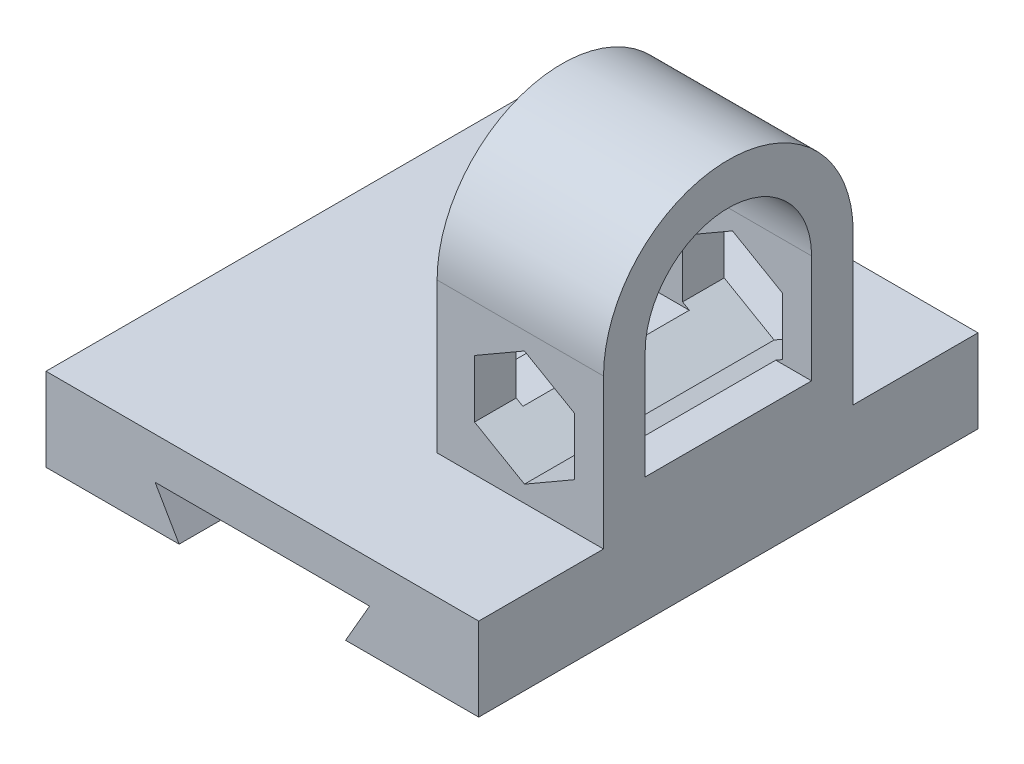
ISO-10303-21;
HEADER;
FILE_DESCRIPTION(('STEP AP214'),'2;1');
FILE_NAME('part.step','',(''),(''),'','','');
FILE_SCHEMA(('AUTOMOTIVE_DESIGN { 1 0 10303 214 1 1 1 1 }'));
ENDSEC;
DATA;
#1=APPLICATION_CONTEXT('core data for automotive mechanical design processes');
#2=APPLICATION_PROTOCOL_DEFINITION('international standard','automotive_design',2000,#1);
#3=PRODUCT_CONTEXT('',#1,'mechanical');
#4=PRODUCT('Part','Part','',(#3));
#5=PRODUCT_RELATED_PRODUCT_CATEGORY('part','',(#4));
#6=PRODUCT_DEFINITION_FORMATION('','',#4);
#7=PRODUCT_DEFINITION_CONTEXT('part definition',#1,'design');
#8=PRODUCT_DEFINITION('design','',#6,#7);
#9=PRODUCT_DEFINITION_SHAPE('','',#8);
#10=(LENGTH_UNIT() NAMED_UNIT(*) SI_UNIT(.MILLI.,.METRE.));
#11=(NAMED_UNIT(*) PLANE_ANGLE_UNIT() SI_UNIT($,.RADIAN.));
#12=(NAMED_UNIT(*) SI_UNIT($,.STERADIAN.) SOLID_ANGLE_UNIT());
#13=UNCERTAINTY_MEASURE_WITH_UNIT(LENGTH_MEASURE(1.E-05),#10,'distance_accuracy_value','');
#14=(GEOMETRIC_REPRESENTATION_CONTEXT(3) GLOBAL_UNCERTAINTY_ASSIGNED_CONTEXT((#13)) GLOBAL_UNIT_ASSIGNED_CONTEXT((#10,
#11,#12)) REPRESENTATION_CONTEXT('',''));
#15=CARTESIAN_POINT('',(0.,0.,0.));
#16=DIRECTION('',(0.,0.,1.));
#17=DIRECTION('',(1.,0.,0.));
#18=AXIS2_PLACEMENT_3D('',#15,#16,#17);
#19=CARTESIAN_POINT('',(5.99999999999999,9.99999999999998,0.));
#20=DIRECTION('',(0.,1.,0.));
#21=DIRECTION('',(-1.,0.,0.));
#22=AXIS2_PLACEMENT_3D('',#19,#20,#21);
#23=PLANE('',#22);
#24=DIRECTION('',(0.,0.,1.));
#25=VECTOR('',#24,1.);
#26=CARTESIAN_POINT('',(21.6961524227066,10.,-30.001));
#27=LINE('',#26,#25);
#28=CARTESIAN_POINT('',(21.6961524227066,10.,-10.));
#29=VERTEX_POINT('',#28);
#30=CARTESIAN_POINT('',(21.6961524227066,9.99999999999999,9.99999999999999));
#31=VERTEX_POINT('',#30);
#32=EDGE_CURVE('E638',#29,#31,#27,.T.);
#33=ORIENTED_EDGE('',*,*,#32,.T.);
#34=DIRECTION('',(1.,0.,0.));
#35=VECTOR('',#34,1.);
#36=CARTESIAN_POINT('',(5.99999999999999,9.99999999999998,10.));
#37=LINE('',#36,#35);
#38=CARTESIAN_POINT('',(26.,10.,10.));
#39=VERTEX_POINT('',#38);
#40=EDGE_CURVE('E282',#31,#39,#37,.T.);
#41=ORIENTED_EDGE('',*,*,#40,.T.);
#42=DIRECTION('',(0.,0.,1.));
#43=VECTOR('',#42,1.);
#44=CARTESIAN_POINT('',(26.,10.,0.));
#45=LINE('',#44,#43);
#46=CARTESIAN_POINT('',(26.,10.,-10.));
#47=VERTEX_POINT('',#46);
#48=EDGE_CURVE('E682',#47,#39,#45,.T.);
#49=ORIENTED_EDGE('',*,*,#48,.F.);
#50=DIRECTION('',(1.,0.,0.));
#51=VECTOR('',#50,1.);
#52=CARTESIAN_POINT('',(5.99999999999999,9.99999999999998,-10.));
#53=LINE('',#52,#51);
#54=EDGE_CURVE('E281',#29,#47,#53,.T.);
#55=ORIENTED_EDGE('',*,*,#54,.F.);
#56=EDGE_LOOP('',(#33,#41,#49,#55));
#57=FACE_BOUND('',#56,.T.);
#58=ADVANCED_FACE('F59',(#57),#23,.T.);
#59=CARTESIAN_POINT('',(-26.,5.,30.));
#60=DIRECTION('',(0.,-1.,0.));
#61=DIRECTION('',(1.,0.,0.));
#62=AXIS2_PLACEMENT_3D('',#59,#60,#61);
#63=PLANE('',#62);
#64=DIRECTION('',(1.,0.,0.));
#65=VECTOR('',#64,1.);
#66=CARTESIAN_POINT('',(6.,4.99999999999998,15.));
#67=LINE('',#66,#65);
#68=CARTESIAN_POINT('',(6.,4.99999999999998,15.));
#69=VERTEX_POINT('',#68);
#70=CARTESIAN_POINT('',(26.,5.,15.));
#71=VERTEX_POINT('',#70);
#72=EDGE_CURVE('E312',#69,#71,#67,.T.);
#73=ORIENTED_EDGE('',*,*,#72,.F.);
#74=DIRECTION('',(0.,0.,1.));
#75=VECTOR('',#74,1.);
#76=CARTESIAN_POINT('',(6.,4.99999999999998,0.));
#77=LINE('',#76,#75);
#78=CARTESIAN_POINT('',(6.,4.99999999999998,-15.));
#79=VERTEX_POINT('',#78);
#80=EDGE_CURVE('E300',#79,#69,#77,.T.);
#81=ORIENTED_EDGE('',*,*,#80,.F.);
#82=DIRECTION('',(1.,0.,0.));
#83=VECTOR('',#82,1.);
#84=CARTESIAN_POINT('',(6.,4.99999999999998,-15.));
#85=LINE('',#84,#83);
#86=CARTESIAN_POINT('',(26.,5.,-15.));
#87=VERTEX_POINT('',#86);
#88=EDGE_CURVE('E314',#79,#87,#85,.T.);
#89=ORIENTED_EDGE('',*,*,#88,.T.);
#90=DIRECTION('',(0.,0.,-1.));
#91=VECTOR('',#90,1.);
#92=CARTESIAN_POINT('',(26.,5.,30.));
#93=LINE('',#92,#91);
#94=CARTESIAN_POINT('',(26.,5.,-30.));
#95=VERTEX_POINT('',#94);
#96=EDGE_CURVE('E358',#87,#95,#93,.T.);
#97=ORIENTED_EDGE('',*,*,#96,.T.);
#98=DIRECTION('',(-1.,0.,0.));
#99=VECTOR('',#98,1.);
#100=CARTESIAN_POINT('',(-26.,5.,-30.));
#101=LINE('',#100,#99);
#102=CARTESIAN_POINT('',(-26.,5.,-30.));
#103=VERTEX_POINT('',#102);
#104=EDGE_CURVE('E325',#95,#103,#101,.T.);
#105=ORIENTED_EDGE('',*,*,#104,.T.);
#106=DIRECTION('',(0.,0.,-1.));
#107=VECTOR('',#106,1.);
#108=CARTESIAN_POINT('',(-26.,5.,30.));
#109=LINE('',#108,#107);
#110=CARTESIAN_POINT('',(-26.,5.,30.));
#111=VERTEX_POINT('',#110);
#112=EDGE_CURVE('E339',#111,#103,#109,.T.);
#113=ORIENTED_EDGE('',*,*,#112,.F.);
#114=DIRECTION('',(-1.,0.,0.));
#115=VECTOR('',#114,1.);
#116=CARTESIAN_POINT('',(-26.,5.,30.));
#117=LINE('',#116,#115);
#118=CARTESIAN_POINT('',(26.,5.,30.));
#119=VERTEX_POINT('',#118);
#120=EDGE_CURVE('E337',#119,#111,#117,.T.);
#121=ORIENTED_EDGE('',*,*,#120,.F.);
#122=EDGE_CURVE('E359',#119,#71,#93,.T.);
#123=ORIENTED_EDGE('',*,*,#122,.T.);
#124=EDGE_LOOP('',(#73,#81,#89,#97,#105,#113,#121,#123));
#125=FACE_BOUND('',#124,.T.);
#126=ADVANCED_FACE('F408',(#125),#63,.F.);
#127=CARTESIAN_POINT('',(-26.,-5.00000000000001,30.));
#128=DIRECTION('',(1.,0.,0.));
#129=DIRECTION('',(0.,0.,-1.));
#130=AXIS2_PLACEMENT_3D('',#127,#128,#129);
#131=PLANE('',#130);
#132=DIRECTION('',(0.,-1.,0.));
#133=VECTOR('',#132,1.);
#134=CARTESIAN_POINT('',(-26.,-5.00000000000001,-30.));
#135=LINE('',#134,#133);
#136=CARTESIAN_POINT('',(-26.,-5.00000000000001,-30.));
#137=VERTEX_POINT('',#136);
#138=EDGE_CURVE('E320',#103,#137,#135,.T.);
#139=ORIENTED_EDGE('',*,*,#138,.T.);
#140=DIRECTION('',(0.,0.,-1.));
#141=VECTOR('',#140,1.);
#142=CARTESIAN_POINT('',(-26.,-5.00000000000001,30.));
#143=LINE('',#142,#141);
#144=CARTESIAN_POINT('',(-26.,-5.00000000000001,30.));
#145=VERTEX_POINT('',#144);
#146=EDGE_CURVE('E12',#145,#137,#143,.T.);
#147=ORIENTED_EDGE('',*,*,#146,.F.);
#148=DIRECTION('',(0.,-1.,0.));
#149=VECTOR('',#148,1.);
#150=CARTESIAN_POINT('',(-26.,-5.00000000000001,30.));
#151=LINE('',#150,#149);
#152=EDGE_CURVE('E321',#111,#145,#151,.T.);
#153=ORIENTED_EDGE('',*,*,#152,.F.);
#154=ORIENTED_EDGE('',*,*,#112,.T.);
#155=EDGE_LOOP('',(#139,#147,#153,#154));
#156=FACE_BOUND('',#155,.T.);
#157=ADVANCED_FACE('F61',(#156),#131,.F.);
#158=CARTESIAN_POINT('',(-9.99999999999999,-5.,30.));
#159=DIRECTION('',(0.,1.,0.));
#160=DIRECTION('',(-1.,0.,0.));
#161=AXIS2_PLACEMENT_3D('',#158,#159,#160);
#162=PLANE('',#161);
#163=DIRECTION('',(1.,0.,0.));
#164=VECTOR('',#163,1.);
#165=CARTESIAN_POINT('',(-9.99999999999999,-5.,-30.));
#166=LINE('',#165,#164);
#167=CARTESIAN_POINT('',(-9.99999999999999,-5.,-30.));
#168=VERTEX_POINT('',#167);
#169=EDGE_CURVE('E342',#137,#168,#166,.T.);
#170=ORIENTED_EDGE('',*,*,#169,.T.);
#171=DIRECTION('',(0.,0.,-1.));
#172=VECTOR('',#171,1.);
#173=CARTESIAN_POINT('',(-9.99999999999999,-5.,30.));
#174=LINE('',#173,#172);
#175=CARTESIAN_POINT('',(-9.99999999999999,-5.,30.));
#176=VERTEX_POINT('',#175);
#177=EDGE_CURVE('E67',#176,#168,#174,.T.);
#178=ORIENTED_EDGE('',*,*,#177,.F.);
#179=DIRECTION('',(1.,0.,0.));
#180=VECTOR('',#179,1.);
#181=CARTESIAN_POINT('',(-9.99999999999999,-5.,30.));
#182=LINE('',#181,#180);
#183=EDGE_CURVE('E324',#145,#176,#182,.T.);
#184=ORIENTED_EDGE('',*,*,#183,.F.);
#185=ORIENTED_EDGE('',*,*,#146,.T.);
#186=EDGE_LOOP('',(#170,#178,#184,#185));
#187=FACE_BOUND('',#186,.T.);
#188=ADVANCED_FACE('F401',(#187),#162,.F.);
#189=CARTESIAN_POINT('',(-12.8867513459481,0.,30.));
#190=DIRECTION('',(-0.866025403784438,-0.500000000000001,0.));
#191=DIRECTION('',(0.500000000000001,-0.866025403784438,0.));
#192=AXIS2_PLACEMENT_3D('',#189,#190,#191);
#193=PLANE('',#192);
#194=DIRECTION('',(-0.500000000000001,0.866025403784438,0.));
#195=VECTOR('',#194,1.);
#196=CARTESIAN_POINT('',(-12.8867513459481,0.,-30.));
#197=LINE('',#196,#195);
#198=CARTESIAN_POINT('',(-12.8867513459481,0.,-30.));
#199=VERTEX_POINT('',#198);
#200=EDGE_CURVE('E344',#168,#199,#197,.T.);
#201=ORIENTED_EDGE('',*,*,#200,.T.);
#202=DIRECTION('',(0.,0.,-1.));
#203=VECTOR('',#202,1.);
#204=CARTESIAN_POINT('',(-12.8867513459481,0.,30.));
#205=LINE('',#204,#203);
#206=CARTESIAN_POINT('',(-12.8867513459481,0.,30.));
#207=VERTEX_POINT('',#206);
#208=EDGE_CURVE('E371',#207,#199,#205,.T.);
#209=ORIENTED_EDGE('',*,*,#208,.F.);
#210=DIRECTION('',(-0.500000000000001,0.866025403784438,0.));
#211=VECTOR('',#210,1.);
#212=CARTESIAN_POINT('',(-12.8867513459481,0.,30.));
#213=LINE('',#212,#211);
#214=EDGE_CURVE('E327',#176,#207,#213,.T.);
#215=ORIENTED_EDGE('',*,*,#214,.F.);
#216=ORIENTED_EDGE('',*,*,#177,.T.);
#217=EDGE_LOOP('',(#201,#209,#215,#216));
#218=FACE_BOUND('',#217,.T.);
#219=ADVANCED_FACE('F378',(#218),#193,.F.);
#220=CARTESIAN_POINT('',(12.8867513459482,0.,30.));
#221=DIRECTION('',(0.,1.,0.));
#222=DIRECTION('',(-1.,0.,0.));
#223=AXIS2_PLACEMENT_3D('',#220,#221,#222);
#224=PLANE('',#223);
#225=DIRECTION('',(1.,0.,0.));
#226=VECTOR('',#225,1.);
#227=CARTESIAN_POINT('',(12.8867513459482,0.,-30.));
#228=LINE('',#227,#226);
#229=CARTESIAN_POINT('',(12.8867513459482,0.,-30.));
#230=VERTEX_POINT('',#229);
#231=EDGE_CURVE('E346',#199,#230,#228,.T.);
#232=ORIENTED_EDGE('',*,*,#231,.T.);
#233=DIRECTION('',(0.,0.,-1.));
#234=VECTOR('',#233,1.);
#235=CARTESIAN_POINT('',(12.8867513459482,0.,30.));
#236=LINE('',#235,#234);
#237=CARTESIAN_POINT('',(12.8867513459482,0.,30.));
#238=VERTEX_POINT('',#237);
#239=EDGE_CURVE('E368',#238,#230,#236,.T.);
#240=ORIENTED_EDGE('',*,*,#239,.F.);
#241=DIRECTION('',(1.,0.,0.));
#242=VECTOR('',#241,1.);
#243=CARTESIAN_POINT('',(12.8867513459482,0.,30.));
#244=LINE('',#243,#242);
#245=EDGE_CURVE('E329',#207,#238,#244,.T.);
#246=ORIENTED_EDGE('',*,*,#245,.F.);
#247=ORIENTED_EDGE('',*,*,#208,.T.);
#248=EDGE_LOOP('',(#232,#240,#246,#247));
#249=FACE_BOUND('',#248,.T.);
#250=ADVANCED_FACE('F389',(#249),#224,.F.);
#251=CARTESIAN_POINT('',(10.,-5.,30.));
#252=DIRECTION('',(0.866025403784436,-0.500000000000005,0.));
#253=DIRECTION('',(0.500000000000005,0.866025403784436,0.));
#254=AXIS2_PLACEMENT_3D('',#251,#252,#253);
#255=PLANE('',#254);
#256=DIRECTION('',(-0.500000000000005,-0.866025403784436,0.));
#257=VECTOR('',#256,1.);
#258=CARTESIAN_POINT('',(10.,-5.,-30.));
#259=LINE('',#258,#257);
#260=CARTESIAN_POINT('',(10.,-5.,-30.));
#261=VERTEX_POINT('',#260);
#262=EDGE_CURVE('E348',#230,#261,#259,.T.);
#263=ORIENTED_EDGE('',*,*,#262,.T.);
#264=DIRECTION('',(0.,0.,-1.));
#265=VECTOR('',#264,1.);
#266=CARTESIAN_POINT('',(10.,-5.,30.));
#267=LINE('',#266,#265);
#268=CARTESIAN_POINT('',(10.,-5.,30.));
#269=VERTEX_POINT('',#268);
#270=EDGE_CURVE('E365',#269,#261,#267,.T.);
#271=ORIENTED_EDGE('',*,*,#270,.F.);
#272=DIRECTION('',(-0.500000000000005,-0.866025403784436,0.));
#273=VECTOR('',#272,1.);
#274=CARTESIAN_POINT('',(10.,-5.,30.));
#275=LINE('',#274,#273);
#276=EDGE_CURVE('E331',#238,#269,#275,.T.);
#277=ORIENTED_EDGE('',*,*,#276,.F.);
#278=ORIENTED_EDGE('',*,*,#239,.T.);
#279=EDGE_LOOP('',(#263,#271,#277,#278));
#280=FACE_BOUND('',#279,.T.);
#281=ADVANCED_FACE('F393',(#280),#255,.F.);
#282=CARTESIAN_POINT('',(26.,-5.,30.));
#283=DIRECTION('',(0.,1.,0.));
#284=DIRECTION('',(-1.,0.,0.));
#285=AXIS2_PLACEMENT_3D('',#282,#283,#284);
#286=PLANE('',#285);
#287=DIRECTION('',(1.,0.,0.));
#288=VECTOR('',#287,1.);
#289=CARTESIAN_POINT('',(26.,-5.,-30.));
#290=LINE('',#289,#288);
#291=CARTESIAN_POINT('',(26.,-5.,-30.));
#292=VERTEX_POINT('',#291);
#293=EDGE_CURVE('E350',#261,#292,#290,.T.);
#294=ORIENTED_EDGE('',*,*,#293,.T.);
#295=DIRECTION('',(0.,0.,-1.));
#296=VECTOR('',#295,1.);
#297=CARTESIAN_POINT('',(26.,-5.,30.));
#298=LINE('',#297,#296);
#299=CARTESIAN_POINT('',(26.,-5.,30.));
#300=VERTEX_POINT('',#299);
#301=EDGE_CURVE('E362',#300,#292,#298,.T.);
#302=ORIENTED_EDGE('',*,*,#301,.F.);
#303=DIRECTION('',(1.,0.,0.));
#304=VECTOR('',#303,1.);
#305=CARTESIAN_POINT('',(26.,-5.,30.));
#306=LINE('',#305,#304);
#307=EDGE_CURVE('E333',#269,#300,#306,.T.);
#308=ORIENTED_EDGE('',*,*,#307,.F.);
#309=ORIENTED_EDGE('',*,*,#270,.T.);
#310=EDGE_LOOP('',(#294,#302,#308,#309));
#311=FACE_BOUND('',#310,.T.);
#312=ADVANCED_FACE('F419',(#311),#286,.F.);
#313=CARTESIAN_POINT('',(26.,5.,30.));
#314=DIRECTION('',(-1.,0.,0.));
#315=DIRECTION('',(0.,-1.,0.));
#316=AXIS2_PLACEMENT_3D('',#313,#314,#315);
#317=PLANE('',#316);
#318=DIRECTION('',(0.,1.,0.));
#319=VECTOR('',#318,1.);
#320=CARTESIAN_POINT('',(26.,5.,-30.));
#321=LINE('',#320,#319);
#322=EDGE_CURVE('E352',#292,#95,#321,.T.);
#323=ORIENTED_EDGE('',*,*,#322,.T.);
#324=ORIENTED_EDGE('',*,*,#96,.F.);
#325=DIRECTION('',(0.,-1.,0.));
#326=VECTOR('',#325,1.);
#327=CARTESIAN_POINT('',(26.,0.,-15.));
#328=LINE('',#327,#326);
#329=CARTESIAN_POINT('',(26.,23.,-15.));
#330=VERTEX_POINT('',#329);
#331=EDGE_CURVE('E307',#330,#87,#328,.T.);
#332=ORIENTED_EDGE('',*,*,#331,.F.);
#333=CARTESIAN_POINT('',(26.,23.,0.));
#334=DIRECTION('',(1.,0.,0.));
#335=DIRECTION('',(0.,1.,0.));
#336=AXIS2_PLACEMENT_3D('',#333,#334,#335);
#337=CIRCLE('',#336,15.);
#338=CARTESIAN_POINT('',(26.,23.,15.));
#339=VERTEX_POINT('',#338);
#340=EDGE_CURVE('E293',#339,#330,#337,.F.);
#341=ORIENTED_EDGE('',*,*,#340,.F.);
#342=DIRECTION('',(0.,1.,0.));
#343=VECTOR('',#342,1.);
#344=CARTESIAN_POINT('',(26.,0.,15.));
#345=LINE('',#344,#343);
#346=EDGE_CURVE('E298',#71,#339,#345,.T.);
#347=ORIENTED_EDGE('',*,*,#346,.F.);
#348=ORIENTED_EDGE('',*,*,#122,.F.);
#349=DIRECTION('',(0.,1.,0.));
#350=VECTOR('',#349,1.);
#351=CARTESIAN_POINT('',(26.,5.,30.));
#352=LINE('',#351,#350);
#353=EDGE_CURVE('E335',#300,#119,#352,.T.);
#354=ORIENTED_EDGE('',*,*,#353,.F.);
#355=ORIENTED_EDGE('',*,*,#301,.T.);
#356=EDGE_LOOP('',(#323,#324,#332,#341,#347,#348,#354,#355));
#357=FACE_BOUND('',#356,.T.);
#358=DIRECTION('',(0.,1.,0.));
#359=VECTOR('',#358,1.);
#360=CARTESIAN_POINT('',(26.,0.,10.));
#361=LINE('',#360,#359);
#362=CARTESIAN_POINT('',(26.,23.,10.));
#363=VERTEX_POINT('',#362);
#364=EDGE_CURVE('E672',#39,#363,#361,.T.);
#365=ORIENTED_EDGE('',*,*,#364,.T.);
#366=CARTESIAN_POINT('',(26.,23.,0.));
#367=DIRECTION('',(1.,0.,0.));
#368=DIRECTION('',(0.,-1.,0.));
#369=AXIS2_PLACEMENT_3D('',#366,#367,#368);
#370=CIRCLE('',#369,10.);
#371=CARTESIAN_POINT('',(26.,23.,-10.));
#372=VERTEX_POINT('',#371);
#373=EDGE_CURVE('E264',#363,#372,#370,.F.);
#374=ORIENTED_EDGE('',*,*,#373,.T.);
#375=DIRECTION('',(0.,-1.,0.));
#376=VECTOR('',#375,1.);
#377=CARTESIAN_POINT('',(26.,0.,-10.));
#378=LINE('',#377,#376);
#379=EDGE_CURVE('E679',#372,#47,#378,.T.);
#380=ORIENTED_EDGE('',*,*,#379,.T.);
#381=ORIENTED_EDGE('',*,*,#48,.T.);
#382=EDGE_LOOP('',(#365,#374,#380,#381));
#383=FACE_BOUND('',#382,.T.);
#384=ADVANCED_FACE('F414',(#357,#383),#317,.F.);
#385=CARTESIAN_POINT('',(0.,0.,30.));
#386=DIRECTION('',(0.,0.,-1.));
#387=DIRECTION('',(-1.,0.,0.));
#388=AXIS2_PLACEMENT_3D('',#385,#386,#387);
#389=PLANE('',#388);
#390=ORIENTED_EDGE('',*,*,#152,.T.);
#391=ORIENTED_EDGE('',*,*,#183,.T.);
#392=ORIENTED_EDGE('',*,*,#214,.T.);
#393=ORIENTED_EDGE('',*,*,#245,.T.);
#394=ORIENTED_EDGE('',*,*,#276,.T.);
#395=ORIENTED_EDGE('',*,*,#307,.T.);
#396=ORIENTED_EDGE('',*,*,#353,.T.);
#397=ORIENTED_EDGE('',*,*,#120,.T.);
#398=EDGE_LOOP('',(#390,#391,#392,#393,#394,#395,#396,#397));
#399=FACE_BOUND('',#398,.T.);
#400=ADVANCED_FACE('F397',(#399),#389,.F.);
#401=CARTESIAN_POINT('',(0.,0.,-30.));
#402=DIRECTION('',(0.,0.,-1.));
#403=DIRECTION('',(-1.,0.,0.));
#404=AXIS2_PLACEMENT_3D('',#401,#402,#403);
#405=PLANE('',#404);
#406=ORIENTED_EDGE('',*,*,#138,.F.);
#407=ORIENTED_EDGE('',*,*,#104,.F.);
#408=ORIENTED_EDGE('',*,*,#322,.F.);
#409=ORIENTED_EDGE('',*,*,#293,.F.);
#410=ORIENTED_EDGE('',*,*,#262,.F.);
#411=ORIENTED_EDGE('',*,*,#231,.F.);
#412=ORIENTED_EDGE('',*,*,#200,.F.);
#413=ORIENTED_EDGE('',*,*,#169,.F.);
#414=EDGE_LOOP('',(#406,#407,#408,#409,#410,#411,#412,#413));
#415=FACE_BOUND('',#414,.T.);
#416=ADVANCED_FACE('F384',(#415),#405,.T.);
#417=CARTESIAN_POINT('',(5.99999999999998,23.,0.));
#418=DIRECTION('',(1.,0.,0.));
#419=DIRECTION('',(0.,1.,0.));
#420=AXIS2_PLACEMENT_3D('',#417,#418,#419);
#421=PLANE('',#420);
#422=CARTESIAN_POINT('',(5.99999999999998,23.,0.));
#423=DIRECTION('',(1.,0.,0.));
#424=DIRECTION('',(0.,1.,0.));
#425=AXIS2_PLACEMENT_3D('',#422,#423,#424);
#426=CIRCLE('',#425,15.);
#427=CARTESIAN_POINT('',(5.99999999999998,23.,15.));
#428=VERTEX_POINT('',#427);
#429=CARTESIAN_POINT('',(5.99999999999998,23.,-15.));
#430=VERTEX_POINT('',#429);
#431=EDGE_CURVE('E294',#428,#430,#426,.F.);
#432=ORIENTED_EDGE('',*,*,#431,.T.);
#433=DIRECTION('',(0.,-1.,0.));
#434=VECTOR('',#433,1.);
#435=CARTESIAN_POINT('',(6.00000000000001,0.,-15.));
#436=LINE('',#435,#434);
#437=EDGE_CURVE('E297',#430,#79,#436,.T.);
#438=ORIENTED_EDGE('',*,*,#437,.T.);
#439=ORIENTED_EDGE('',*,*,#80,.T.);
#440=DIRECTION('',(0.,1.,0.));
#441=VECTOR('',#440,1.);
#442=CARTESIAN_POINT('',(6.00000000000001,0.,15.));
#443=LINE('',#442,#441);
#444=EDGE_CURVE('E302',#69,#428,#443,.T.);
#445=ORIENTED_EDGE('',*,*,#444,.T.);
#446=EDGE_LOOP('',(#432,#438,#439,#445));
#447=FACE_BOUND('',#446,.T.);
#448=CARTESIAN_POINT('',(5.99999999999998,23.,0.));
#449=DIRECTION('',(1.,0.,0.));
#450=DIRECTION('',(0.,-1.,0.));
#451=AXIS2_PLACEMENT_3D('',#448,#449,#450);
#452=CIRCLE('',#451,10.);
#453=CARTESIAN_POINT('',(5.99999999999998,23.,10.));
#454=VERTEX_POINT('',#453);
#455=CARTESIAN_POINT('',(5.99999999999998,23.,-10.));
#456=VERTEX_POINT('',#455);
#457=EDGE_CURVE('E669',#454,#456,#452,.F.);
#458=ORIENTED_EDGE('',*,*,#457,.F.);
#459=DIRECTION('',(0.,1.,0.));
#460=VECTOR('',#459,1.);
#461=CARTESIAN_POINT('',(6.00000000000001,0.,10.));
#462=LINE('',#461,#460);
#463=CARTESIAN_POINT('',(6.,9.99999999999998,10.));
#464=VERTEX_POINT('',#463);
#465=EDGE_CURVE('E675',#464,#454,#462,.T.);
#466=ORIENTED_EDGE('',*,*,#465,.F.);
#467=DIRECTION('',(0.,0.,1.));
#468=VECTOR('',#467,1.);
#469=CARTESIAN_POINT('',(5.99999999999999,9.99999999999998,0.));
#470=LINE('',#469,#468);
#471=CARTESIAN_POINT('',(5.99999999999999,9.99999999999998,-10.));
#472=VERTEX_POINT('',#471);
#473=EDGE_CURVE('E279',#472,#464,#470,.T.);
#474=ORIENTED_EDGE('',*,*,#473,.F.);
#475=DIRECTION('',(0.,-1.,0.));
#476=VECTOR('',#475,1.);
#477=CARTESIAN_POINT('',(6.00000000000001,0.,-10.));
#478=LINE('',#477,#476);
#479=EDGE_CURVE('E671',#456,#472,#478,.T.);
#480=ORIENTED_EDGE('',*,*,#479,.F.);
#481=EDGE_LOOP('',(#458,#466,#474,#480));
#482=FACE_BOUND('',#481,.T.);
#483=ADVANCED_FACE('F455',(#447,#482),#421,.F.);
#484=CARTESIAN_POINT('',(5.99999999999998,23.,0.));
#485=DIRECTION('',(1.,0.,0.));
#486=DIRECTION('',(0.,1.,0.));
#487=AXIS2_PLACEMENT_3D('',#484,#485,#486);
#488=CYLINDRICAL_SURFACE('',#487,15.);
#489=ORIENTED_EDGE('',*,*,#340,.T.);
#490=DIRECTION('',(1.,0.,0.));
#491=VECTOR('',#490,1.);
#492=CARTESIAN_POINT('',(5.99999999999998,23.,-15.));
#493=LINE('',#492,#491);
#494=EDGE_CURVE('E317',#430,#330,#493,.T.);
#495=ORIENTED_EDGE('',*,*,#494,.F.);
#496=ORIENTED_EDGE('',*,*,#431,.F.);
#497=DIRECTION('',(1.,0.,0.));
#498=VECTOR('',#497,1.);
#499=CARTESIAN_POINT('',(5.99999999999998,23.,15.));
#500=LINE('',#499,#498);
#501=EDGE_CURVE('E304',#428,#339,#500,.T.);
#502=ORIENTED_EDGE('',*,*,#501,.T.);
#503=EDGE_LOOP('',(#489,#495,#496,#502));
#504=FACE_BOUND('',#503,.T.);
#505=ADVANCED_FACE('F458',(#504),#488,.T.);
#506=CARTESIAN_POINT('',(6.00000000000001,0.,-15.));
#507=DIRECTION('',(0.,0.,1.));
#508=DIRECTION('',(0.,-1.,0.));
#509=AXIS2_PLACEMENT_3D('',#506,#507,#508);
#510=PLANE('',#509);
#511=DIRECTION('',(-0.866025403784439,-0.5,0.));
#512=VECTOR('',#511,1.);
#513=CARTESIAN_POINT('',(16.5,6.99999999999999,-15.));
#514=LINE('',#513,#512);
#515=CARTESIAN_POINT('',(22.5,10.4641016151377,-15.));
#516=VERTEX_POINT('',#515);
#517=CARTESIAN_POINT('',(16.5,6.99999999999999,-15.));
#518=VERTEX_POINT('',#517);
#519=EDGE_CURVE('E699',#516,#518,#514,.T.);
#520=ORIENTED_EDGE('',*,*,#519,.F.);
#521=DIRECTION('',(0.,-1.,0.));
#522=VECTOR('',#521,1.);
#523=CARTESIAN_POINT('',(22.5,10.4641016151377,-15.));
#524=LINE('',#523,#522);
#525=CARTESIAN_POINT('',(22.5,17.3923048454132,-15.));
#526=VERTEX_POINT('',#525);
#527=EDGE_CURVE('E697',#526,#516,#524,.T.);
#528=ORIENTED_EDGE('',*,*,#527,.F.);
#529=DIRECTION('',(0.866025403784439,-0.5,0.));
#530=VECTOR('',#529,1.);
#531=CARTESIAN_POINT('',(22.5,17.3923048454132,-15.));
#532=LINE('',#531,#530);
#533=CARTESIAN_POINT('',(16.5,20.856406460551,-15.));
#534=VERTEX_POINT('',#533);
#535=EDGE_CURVE('E265',#534,#526,#532,.T.);
#536=ORIENTED_EDGE('',*,*,#535,.F.);
#537=DIRECTION('',(0.866025403784439,0.5,0.));
#538=VECTOR('',#537,1.);
#539=CARTESIAN_POINT('',(16.5,20.856406460551,-15.));
#540=LINE('',#539,#538);
#541=CARTESIAN_POINT('',(10.5,17.3923048454132,-15.));
#542=VERTEX_POINT('',#541);
#543=EDGE_CURVE('E74',#542,#534,#540,.T.);
#544=ORIENTED_EDGE('',*,*,#543,.F.);
#545=DIRECTION('',(0.,1.,0.));
#546=VECTOR('',#545,1.);
#547=CARTESIAN_POINT('',(10.5,17.3923048454132,-15.));
#548=LINE('',#547,#546);
#549=CARTESIAN_POINT('',(10.5,10.4641016151377,-15.));
#550=VERTEX_POINT('',#549);
#551=EDGE_CURVE('E706',#550,#542,#548,.T.);
#552=ORIENTED_EDGE('',*,*,#551,.F.);
#553=DIRECTION('',(-0.866025403784439,0.5,0.));
#554=VECTOR('',#553,1.);
#555=CARTESIAN_POINT('',(10.5,10.4641016151377,-15.));
#556=LINE('',#555,#554);
#557=EDGE_CURVE('E704',#518,#550,#556,.T.);
#558=ORIENTED_EDGE('',*,*,#557,.F.);
#559=EDGE_LOOP('',(#520,#528,#536,#544,#552,#558));
#560=FACE_BOUND('',#559,.T.);
#561=ORIENTED_EDGE('',*,*,#331,.T.);
#562=ORIENTED_EDGE('',*,*,#88,.F.);
#563=ORIENTED_EDGE('',*,*,#437,.F.);
#564=ORIENTED_EDGE('',*,*,#494,.T.);
#565=EDGE_LOOP('',(#561,#562,#563,#564));
#566=FACE_BOUND('',#565,.T.);
#567=ADVANCED_FACE('F462',(#560,#566),#510,.F.);
#568=CARTESIAN_POINT('',(6.00000000000001,0.,15.));
#569=DIRECTION('',(0.,0.,-1.));
#570=DIRECTION('',(0.,1.,0.));
#571=AXIS2_PLACEMENT_3D('',#568,#569,#570);
#572=PLANE('',#571);
#573=DIRECTION('',(0.,1.,0.));
#574=VECTOR('',#573,1.);
#575=CARTESIAN_POINT('',(22.5,10.4641016151377,15.));
#576=LINE('',#575,#574);
#577=CARTESIAN_POINT('',(22.5,10.4641016151377,15.));
#578=VERTEX_POINT('',#577);
#579=CARTESIAN_POINT('',(22.5,17.3923048454132,15.));
#580=VERTEX_POINT('',#579);
#581=EDGE_CURVE('E82',#578,#580,#576,.T.);
#582=ORIENTED_EDGE('',*,*,#581,.F.);
#583=DIRECTION('',(0.866025403784438,0.5,0.));
#584=VECTOR('',#583,1.);
#585=CARTESIAN_POINT('',(16.5,6.99999999999999,15.));
#586=LINE('',#585,#584);
#587=CARTESIAN_POINT('',(16.5,6.99999999999999,15.));
#588=VERTEX_POINT('',#587);
#589=EDGE_CURVE('E628',#588,#578,#586,.T.);
#590=ORIENTED_EDGE('',*,*,#589,.F.);
#591=DIRECTION('',(0.866025403784439,-0.5,0.));
#592=VECTOR('',#591,1.);
#593=CARTESIAN_POINT('',(10.5,10.4641016151377,15.));
#594=LINE('',#593,#592);
#595=CARTESIAN_POINT('',(10.5,10.4641016151377,15.));
#596=VERTEX_POINT('',#595);
#597=EDGE_CURVE('E644',#596,#588,#594,.T.);
#598=ORIENTED_EDGE('',*,*,#597,.F.);
#599=DIRECTION('',(0.,-1.,0.));
#600=VECTOR('',#599,1.);
#601=CARTESIAN_POINT('',(10.5,17.3923048454132,15.));
#602=LINE('',#601,#600);
#603=CARTESIAN_POINT('',(10.5,17.3923048454132,15.));
#604=VERTEX_POINT('',#603);
#605=EDGE_CURVE('E636',#604,#596,#602,.T.);
#606=ORIENTED_EDGE('',*,*,#605,.F.);
#607=DIRECTION('',(-0.866025403784439,-0.5,0.));
#608=VECTOR('',#607,1.);
#609=CARTESIAN_POINT('',(16.5,20.856406460551,15.));
#610=LINE('',#609,#608);
#611=CARTESIAN_POINT('',(16.5,20.856406460551,15.));
#612=VERTEX_POINT('',#611);
#613=EDGE_CURVE('E634',#612,#604,#610,.T.);
#614=ORIENTED_EDGE('',*,*,#613,.F.);
#615=DIRECTION('',(-0.866025403784439,0.5,0.));
#616=VECTOR('',#615,1.);
#617=CARTESIAN_POINT('',(22.5,17.3923048454132,15.));
#618=LINE('',#617,#616);
#619=EDGE_CURVE('E622',#580,#612,#618,.T.);
#620=ORIENTED_EDGE('',*,*,#619,.F.);
#621=EDGE_LOOP('',(#582,#590,#598,#606,#614,#620));
#622=FACE_BOUND('',#621,.T.);
#623=ORIENTED_EDGE('',*,*,#346,.T.);
#624=ORIENTED_EDGE('',*,*,#501,.F.);
#625=ORIENTED_EDGE('',*,*,#444,.F.);
#626=ORIENTED_EDGE('',*,*,#72,.T.);
#627=EDGE_LOOP('',(#623,#624,#625,#626));
#628=FACE_BOUND('',#627,.T.);
#629=ADVANCED_FACE('F450',(#622,#628),#572,.F.);
#630=CARTESIAN_POINT('',(5.99999999999998,23.,0.));
#631=DIRECTION('',(1.,0.,0.));
#632=DIRECTION('',(0.,1.,0.));
#633=AXIS2_PLACEMENT_3D('',#630,#631,#632);
#634=CYLINDRICAL_SURFACE('',#633,10.);
#635=ORIENTED_EDGE('',*,*,#373,.F.);
#636=DIRECTION('',(1.,0.,0.));
#637=VECTOR('',#636,1.);
#638=CARTESIAN_POINT('',(5.99999999999998,23.,10.));
#639=LINE('',#638,#637);
#640=EDGE_CURVE('E286',#454,#363,#639,.T.);
#641=ORIENTED_EDGE('',*,*,#640,.F.);
#642=ORIENTED_EDGE('',*,*,#457,.T.);
#643=DIRECTION('',(1.,0.,0.));
#644=VECTOR('',#643,1.);
#645=CARTESIAN_POINT('',(5.99999999999998,23.,-10.));
#646=LINE('',#645,#644);
#647=EDGE_CURVE('E290',#456,#372,#646,.T.);
#648=ORIENTED_EDGE('',*,*,#647,.T.);
#649=EDGE_LOOP('',(#635,#641,#642,#648));
#650=FACE_BOUND('',#649,.T.);
#651=ADVANCED_FACE('F445',(#650),#634,.F.);
#652=CARTESIAN_POINT('',(6.00000000000001,0.,-10.));
#653=DIRECTION('',(0.,0.,1.));
#654=DIRECTION('',(0.,-1.,0.));
#655=AXIS2_PLACEMENT_3D('',#652,#653,#654);
#656=PLANE('',#655);
#657=DIRECTION('',(-0.866025403784439,-0.5,0.));
#658=VECTOR('',#657,1.);
#659=CARTESIAN_POINT('',(16.5,6.99999999999999,-10.));
#660=LINE('',#659,#658);
#661=CARTESIAN_POINT('',(22.5,10.4641016151377,-10.));
#662=VERTEX_POINT('',#661);
#663=EDGE_CURVE('E696',#662,#29,#660,.T.);
#664=ORIENTED_EDGE('',*,*,#663,.T.);
#665=ORIENTED_EDGE('',*,*,#54,.T.);
#666=ORIENTED_EDGE('',*,*,#379,.F.);
#667=ORIENTED_EDGE('',*,*,#647,.F.);
#668=ORIENTED_EDGE('',*,*,#479,.T.);
#669=CARTESIAN_POINT('',(11.3038475772934,9.99999999999998,-10.));
#670=VERTEX_POINT('',#669);
#671=EDGE_CURVE('E284',#472,#670,#53,.T.);
#672=ORIENTED_EDGE('',*,*,#671,.T.);
#673=DIRECTION('',(-0.866025403784439,0.5,0.));
#674=VECTOR('',#673,1.);
#675=CARTESIAN_POINT('',(10.5,10.4641016151377,-10.));
#676=LINE('',#675,#674);
#677=CARTESIAN_POINT('',(10.5,10.4641016151377,-10.));
#678=VERTEX_POINT('',#677);
#679=EDGE_CURVE('E259',#670,#678,#676,.T.);
#680=ORIENTED_EDGE('',*,*,#679,.T.);
#681=DIRECTION('',(0.,1.,0.));
#682=VECTOR('',#681,1.);
#683=CARTESIAN_POINT('',(10.5,17.3923048454132,-10.));
#684=LINE('',#683,#682);
#685=CARTESIAN_POINT('',(10.5,17.3923048454133,-10.));
#686=VERTEX_POINT('',#685);
#687=EDGE_CURVE('E714',#678,#686,#684,.T.);
#688=ORIENTED_EDGE('',*,*,#687,.T.);
#689=DIRECTION('',(0.866025403784439,0.5,0.));
#690=VECTOR('',#689,1.);
#691=CARTESIAN_POINT('',(16.5,20.856406460551,-9.99999999999999));
#692=LINE('',#691,#690);
#693=CARTESIAN_POINT('',(16.5,20.856406460551,-10.));
#694=VERTEX_POINT('',#693);
#695=EDGE_CURVE('E717',#686,#694,#692,.T.);
#696=ORIENTED_EDGE('',*,*,#695,.T.);
#697=DIRECTION('',(0.866025403784439,-0.5,0.));
#698=VECTOR('',#697,1.);
#699=CARTESIAN_POINT('',(22.5,17.3923048454132,-10.));
#700=LINE('',#699,#698);
#701=CARTESIAN_POINT('',(22.5,17.3923048454132,-10.));
#702=VERTEX_POINT('',#701);
#703=EDGE_CURVE('E664',#694,#702,#700,.T.);
#704=ORIENTED_EDGE('',*,*,#703,.T.);
#705=DIRECTION('',(0.,-1.,0.));
#706=VECTOR('',#705,1.);
#707=CARTESIAN_POINT('',(22.5,10.4641016151377,-10.));
#708=LINE('',#707,#706);
#709=EDGE_CURVE('E711',#702,#662,#708,.T.);
#710=ORIENTED_EDGE('',*,*,#709,.T.);
#711=EDGE_LOOP('',(#664,#665,#666,#667,#668,#672,#680,#688,#696,#704,#710));
#712=FACE_BOUND('',#711,.T.);
#713=ADVANCED_FACE('F439',(#712),#656,.T.);
#714=DIRECTION('',(0.,0.,-1.));
#715=VECTOR('',#714,1.);
#716=CARTESIAN_POINT('',(11.3038475772934,9.99999999999998,-30.001));
#717=LINE('',#716,#715);
#718=CARTESIAN_POINT('',(11.3038475772934,9.99999999999998,9.99999999999999));
#719=VERTEX_POINT('',#718);
#720=EDGE_CURVE('E251',#719,#670,#717,.T.);
#721=ORIENTED_EDGE('',*,*,#720,.T.);
#722=ORIENTED_EDGE('',*,*,#671,.F.);
#723=ORIENTED_EDGE('',*,*,#473,.T.);
#724=EDGE_CURVE('E271',#464,#719,#37,.T.);
#725=ORIENTED_EDGE('',*,*,#724,.T.);
#726=EDGE_LOOP('',(#721,#722,#723,#725));
#727=FACE_BOUND('',#726,.T.);
#728=ADVANCED_FACE('F277',(#727),#23,.T.);
#729=CARTESIAN_POINT('',(6.00000000000001,0.,10.));
#730=DIRECTION('',(0.,0.,-1.));
#731=DIRECTION('',(0.,1.,0.));
#732=AXIS2_PLACEMENT_3D('',#729,#730,#731);
#733=PLANE('',#732);
#734=DIRECTION('',(0.866025403784439,0.5,0.));
#735=VECTOR('',#734,1.);
#736=CARTESIAN_POINT('',(16.5,6.99999999999999,9.99999999999999));
#737=LINE('',#736,#735);
#738=CARTESIAN_POINT('',(22.5,10.4641016151377,9.99999999999999));
#739=VERTEX_POINT('',#738);
#740=EDGE_CURVE('E720',#31,#739,#737,.T.);
#741=ORIENTED_EDGE('',*,*,#740,.T.);
#742=DIRECTION('',(0.,1.,0.));
#743=VECTOR('',#742,1.);
#744=CARTESIAN_POINT('',(22.5,10.4641016151377,9.99999999999999));
#745=LINE('',#744,#743);
#746=CARTESIAN_POINT('',(22.5,17.3923048454132,9.99999999999999));
#747=VERTEX_POINT('',#746);
#748=EDGE_CURVE('E275',#739,#747,#745,.T.);
#749=ORIENTED_EDGE('',*,*,#748,.T.);
#750=DIRECTION('',(-0.866025403784439,0.5,0.));
#751=VECTOR('',#750,1.);
#752=CARTESIAN_POINT('',(22.5,17.3923048454132,9.99999999999999));
#753=LINE('',#752,#751);
#754=CARTESIAN_POINT('',(16.5,20.856406460551,10.));
#755=VERTEX_POINT('',#754);
#756=EDGE_CURVE('E625',#747,#755,#753,.T.);
#757=ORIENTED_EDGE('',*,*,#756,.T.);
#758=DIRECTION('',(-0.866025403784439,-0.5,0.));
#759=VECTOR('',#758,1.);
#760=CARTESIAN_POINT('',(16.5,20.856406460551,9.99999999999999));
#761=LINE('',#760,#759);
#762=CARTESIAN_POINT('',(10.5,17.3923048454132,9.99999999999999));
#763=VERTEX_POINT('',#762);
#764=EDGE_CURVE('E724',#755,#763,#761,.T.);
#765=ORIENTED_EDGE('',*,*,#764,.T.);
#766=DIRECTION('',(0.,-1.,0.));
#767=VECTOR('',#766,1.);
#768=CARTESIAN_POINT('',(10.5,17.3923048454133,9.99999999999999));
#769=LINE('',#768,#767);
#770=CARTESIAN_POINT('',(10.5,10.4641016151377,9.99999999999999));
#771=VERTEX_POINT('',#770);
#772=EDGE_CURVE('E274',#763,#771,#769,.T.);
#773=ORIENTED_EDGE('',*,*,#772,.T.);
#774=DIRECTION('',(0.866025403784439,-0.5,0.));
#775=VECTOR('',#774,1.);
#776=CARTESIAN_POINT('',(10.5,10.4641016151377,9.99999999999999));
#777=LINE('',#776,#775);
#778=EDGE_CURVE('E255',#771,#719,#777,.T.);
#779=ORIENTED_EDGE('',*,*,#778,.T.);
#780=ORIENTED_EDGE('',*,*,#724,.F.);
#781=ORIENTED_EDGE('',*,*,#465,.T.);
#782=ORIENTED_EDGE('',*,*,#640,.T.);
#783=ORIENTED_EDGE('',*,*,#364,.F.);
#784=ORIENTED_EDGE('',*,*,#40,.F.);
#785=EDGE_LOOP('',(#741,#749,#757,#765,#773,#779,#780,#781,#782,#783,#784));
#786=FACE_BOUND('',#785,.T.);
#787=ADVANCED_FACE('F270',(#786),#733,.T.);
#788=CARTESIAN_POINT('',(22.5,10.4641016151377,-30.001));
#789=DIRECTION('',(1.,0.,0.));
#790=DIRECTION('',(0.,0.,-1.));
#791=AXIS2_PLACEMENT_3D('',#788,#789,#790);
#792=PLANE('',#791);
#793=ORIENTED_EDGE('',*,*,#527,.T.);
#794=DIRECTION('',(0.,0.,1.));
#795=VECTOR('',#794,1.);
#796=CARTESIAN_POINT('',(22.5,10.4641016151377,-30.001));
#797=LINE('',#796,#795);
#798=EDGE_CURVE('E651',#516,#662,#797,.T.);
#799=ORIENTED_EDGE('',*,*,#798,.T.);
#800=ORIENTED_EDGE('',*,*,#709,.F.);
#801=DIRECTION('',(0.,0.,1.));
#802=VECTOR('',#801,1.);
#803=CARTESIAN_POINT('',(22.5,17.3923048454132,-30.001));
#804=LINE('',#803,#802);
#805=EDGE_CURVE('E627',#526,#702,#804,.T.);
#806=ORIENTED_EDGE('',*,*,#805,.F.);
#807=EDGE_LOOP('',(#793,#799,#800,#806));
#808=FACE_BOUND('',#807,.T.);
#809=ADVANCED_FACE('F444',(#808),#792,.F.);
#810=CARTESIAN_POINT('',(16.5,6.99999999999999,-30.001));
#811=DIRECTION('',(0.5,-0.866025403784438,0.));
#812=DIRECTION('',(0.866025403784439,0.5,0.));
#813=AXIS2_PLACEMENT_3D('',#810,#811,#812);
#814=PLANE('',#813);
#815=ORIENTED_EDGE('',*,*,#519,.T.);
#816=DIRECTION('',(0.,0.,1.));
#817=VECTOR('',#816,1.);
#818=CARTESIAN_POINT('',(16.5,6.99999999999999,-30.001));
#819=LINE('',#818,#817);
#820=EDGE_CURVE('E652',#518,#588,#819,.T.);
#821=ORIENTED_EDGE('',*,*,#820,.T.);
#822=ORIENTED_EDGE('',*,*,#589,.T.);
#823=EDGE_CURVE('E649',#739,#578,#797,.T.);
#824=ORIENTED_EDGE('',*,*,#823,.F.);
#825=ORIENTED_EDGE('',*,*,#740,.F.);
#826=ORIENTED_EDGE('',*,*,#32,.F.);
#827=ORIENTED_EDGE('',*,*,#663,.F.);
#828=ORIENTED_EDGE('',*,*,#798,.F.);
#829=EDGE_LOOP('',(#815,#821,#822,#824,#825,#826,#827,#828));
#830=FACE_BOUND('',#829,.T.);
#831=ADVANCED_FACE('F519',(#830),#814,.F.);
#832=CARTESIAN_POINT('',(10.5,10.4641016151377,-30.001));
#833=DIRECTION('',(-0.5,-0.866025403784438,0.));
#834=DIRECTION('',(0.866025403784439,-0.5,0.));
#835=AXIS2_PLACEMENT_3D('',#832,#833,#834);
#836=PLANE('',#835);
#837=ORIENTED_EDGE('',*,*,#557,.T.);
#838=DIRECTION('',(0.,0.,1.));
#839=VECTOR('',#838,1.);
#840=CARTESIAN_POINT('',(10.5,10.4641016151377,-30.001));
#841=LINE('',#840,#839);
#842=EDGE_CURVE('E654',#550,#678,#841,.T.);
#843=ORIENTED_EDGE('',*,*,#842,.T.);
#844=ORIENTED_EDGE('',*,*,#679,.F.);
#845=ORIENTED_EDGE('',*,*,#720,.F.);
#846=ORIENTED_EDGE('',*,*,#778,.F.);
#847=EDGE_CURVE('E655',#771,#596,#841,.T.);
#848=ORIENTED_EDGE('',*,*,#847,.T.);
#849=ORIENTED_EDGE('',*,*,#597,.T.);
#850=ORIENTED_EDGE('',*,*,#820,.F.);
#851=EDGE_LOOP('',(#837,#843,#844,#845,#846,#848,#849,#850));
#852=FACE_BOUND('',#851,.T.);
#853=ADVANCED_FACE('F254',(#852),#836,.F.);
#854=CARTESIAN_POINT('',(10.5,17.3923048454132,-30.001));
#855=DIRECTION('',(-1.,0.,0.));
#856=DIRECTION('',(0.,0.,1.));
#857=AXIS2_PLACEMENT_3D('',#854,#855,#856);
#858=PLANE('',#857);
#859=ORIENTED_EDGE('',*,*,#551,.T.);
#860=DIRECTION('',(0.,0.,1.));
#861=VECTOR('',#860,1.);
#862=CARTESIAN_POINT('',(10.5,17.3923048454132,-30.001));
#863=LINE('',#862,#861);
#864=EDGE_CURVE('E657',#542,#686,#863,.T.);
#865=ORIENTED_EDGE('',*,*,#864,.T.);
#866=ORIENTED_EDGE('',*,*,#687,.F.);
#867=ORIENTED_EDGE('',*,*,#842,.F.);
#868=EDGE_LOOP('',(#859,#865,#866,#867));
#869=FACE_BOUND('',#868,.T.);
#870=ADVANCED_FACE('F538',(#869),#858,.F.);
#871=CARTESIAN_POINT('',(16.5,20.856406460551,-30.001));
#872=DIRECTION('',(-0.5,0.866025403784438,0.));
#873=DIRECTION('',(-0.866025403784439,-0.5,0.));
#874=AXIS2_PLACEMENT_3D('',#871,#872,#873);
#875=PLANE('',#874);
#876=ORIENTED_EDGE('',*,*,#543,.T.);
#877=DIRECTION('',(0.,0.,1.));
#878=VECTOR('',#877,1.);
#879=CARTESIAN_POINT('',(16.5,20.856406460551,-30.001));
#880=LINE('',#879,#878);
#881=EDGE_CURVE('E660',#534,#694,#880,.T.);
#882=ORIENTED_EDGE('',*,*,#881,.T.);
#883=ORIENTED_EDGE('',*,*,#695,.F.);
#884=ORIENTED_EDGE('',*,*,#864,.F.);
#885=EDGE_LOOP('',(#876,#882,#883,#884));
#886=FACE_BOUND('',#885,.T.);
#887=ADVANCED_FACE('F546',(#886),#875,.F.);
#888=CARTESIAN_POINT('',(22.5,17.3923048454132,-30.001));
#889=DIRECTION('',(0.5,0.866025403784439,0.));
#890=DIRECTION('',(-0.866025403784439,0.5,0.));
#891=AXIS2_PLACEMENT_3D('',#888,#889,#890);
#892=PLANE('',#891);
#893=ORIENTED_EDGE('',*,*,#535,.T.);
#894=ORIENTED_EDGE('',*,*,#805,.T.);
#895=ORIENTED_EDGE('',*,*,#703,.F.);
#896=ORIENTED_EDGE('',*,*,#881,.F.);
#897=EDGE_LOOP('',(#893,#894,#895,#896));
#898=FACE_BOUND('',#897,.T.);
#899=ADVANCED_FACE('F556',(#898),#892,.F.);
#900=ORIENTED_EDGE('',*,*,#823,.T.);
#901=ORIENTED_EDGE('',*,*,#581,.T.);
#902=EDGE_CURVE('E620',#747,#580,#804,.T.);
#903=ORIENTED_EDGE('',*,*,#902,.F.);
#904=ORIENTED_EDGE('',*,*,#748,.F.);
#905=EDGE_LOOP('',(#900,#901,#903,#904));
#906=FACE_BOUND('',#905,.T.);
#907=ADVANCED_FACE('F522',(#906),#792,.F.);
#908=EDGE_CURVE('E658',#763,#604,#863,.T.);
#909=ORIENTED_EDGE('',*,*,#908,.T.);
#910=ORIENTED_EDGE('',*,*,#605,.T.);
#911=ORIENTED_EDGE('',*,*,#847,.F.);
#912=ORIENTED_EDGE('',*,*,#772,.F.);
#913=EDGE_LOOP('',(#909,#910,#911,#912));
#914=FACE_BOUND('',#913,.T.);
#915=ADVANCED_FACE('F549',(#914),#858,.F.);
#916=EDGE_CURVE('E661',#755,#612,#880,.T.);
#917=ORIENTED_EDGE('',*,*,#916,.T.);
#918=ORIENTED_EDGE('',*,*,#613,.T.);
#919=ORIENTED_EDGE('',*,*,#908,.F.);
#920=ORIENTED_EDGE('',*,*,#764,.F.);
#921=EDGE_LOOP('',(#917,#918,#919,#920));
#922=FACE_BOUND('',#921,.T.);
#923=ADVANCED_FACE('F558',(#922),#875,.F.);
#924=ORIENTED_EDGE('',*,*,#902,.T.);
#925=ORIENTED_EDGE('',*,*,#619,.T.);
#926=ORIENTED_EDGE('',*,*,#916,.F.);
#927=ORIENTED_EDGE('',*,*,#756,.F.);
#928=EDGE_LOOP('',(#924,#925,#926,#927));
#929=FACE_BOUND('',#928,.T.);
#930=ADVANCED_FACE('F567',(#929),#892,.F.);
#931=CLOSED_SHELL('',(#58,#126,#157,#188,#219,#250,#281,#312,#384,#400,#416,#483,#505,#567,#629,
#651,#713,#728,#787,#809,#831,#853,#870,#887,#899,#907,#915,#923,#930));
#932=MANIFOLD_SOLID_BREP('B2',#931);
#933=ADVANCED_BREP_SHAPE_REPRESENTATION('',(#18,#932),#14);
#934=SHAPE_DEFINITION_REPRESENTATION(#9,#933);
ENDSEC;
END-ISO-10303-21;
